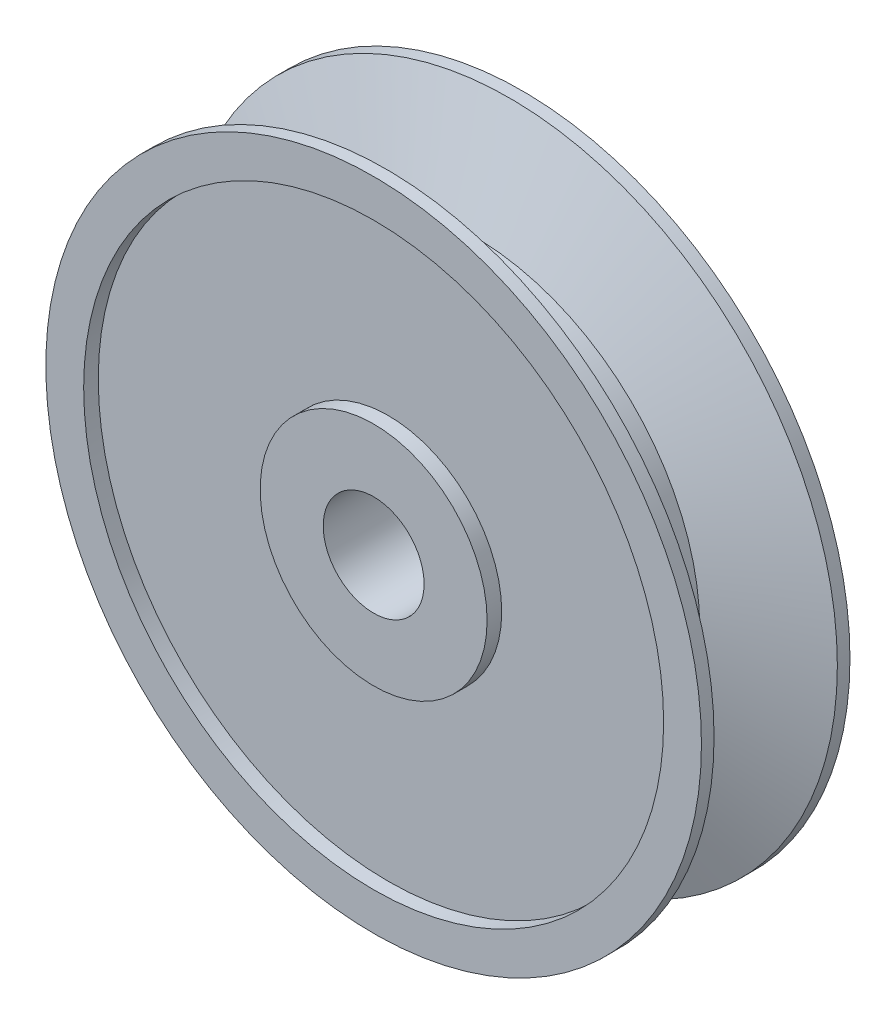
ISO-10303-21;
HEADER;
FILE_DESCRIPTION(('STEP AP214'),'2;1');
FILE_NAME('part.step','',(''),(''),'','','');
FILE_SCHEMA(('AUTOMOTIVE_DESIGN { 1 0 10303 214 1 1 1 1 }'));
ENDSEC;
DATA;
#1=APPLICATION_CONTEXT('core data for automotive mechanical design processes');
#2=APPLICATION_PROTOCOL_DEFINITION('international standard','automotive_design',2000,#1);
#3=PRODUCT_CONTEXT('',#1,'mechanical');
#4=PRODUCT('Part','Part','',(#3));
#5=PRODUCT_RELATED_PRODUCT_CATEGORY('part','',(#4));
#6=PRODUCT_DEFINITION_FORMATION('','',#4);
#7=PRODUCT_DEFINITION_CONTEXT('part definition',#1,'design');
#8=PRODUCT_DEFINITION('design','',#6,#7);
#9=PRODUCT_DEFINITION_SHAPE('','',#8);
#10=(LENGTH_UNIT() NAMED_UNIT(*) SI_UNIT(.MILLI.,.METRE.));
#11=(NAMED_UNIT(*) PLANE_ANGLE_UNIT() SI_UNIT($,.RADIAN.));
#12=(NAMED_UNIT(*) SI_UNIT($,.STERADIAN.) SOLID_ANGLE_UNIT());
#13=UNCERTAINTY_MEASURE_WITH_UNIT(LENGTH_MEASURE(1.E-05),#10,'distance_accuracy_value','');
#14=(GEOMETRIC_REPRESENTATION_CONTEXT(3) GLOBAL_UNCERTAINTY_ASSIGNED_CONTEXT((#13)) GLOBAL_UNIT_ASSIGNED_CONTEXT((#10,
#11,#12)) REPRESENTATION_CONTEXT('',''));
#15=CARTESIAN_POINT('',(0.,0.,0.));
#16=DIRECTION('',(0.,0.,1.));
#17=DIRECTION('',(1.,0.,0.));
#18=AXIS2_PLACEMENT_3D('',#15,#16,#17);
#19=CARTESIAN_POINT('',(0.,0.,0.));
#20=DIRECTION('',(0.,0.,-1.));
#21=DIRECTION('',(1.,0.,0.));
#22=AXIS2_PLACEMENT_3D('',#19,#20,#21);
#23=CYLINDRICAL_SURFACE('',#22,26.);
#24=CARTESIAN_POINT('',(0.,0.,5.89));
#25=DIRECTION('',(0.,0.,1.));
#26=DIRECTION('',(1.,0.,0.));
#27=AXIS2_PLACEMENT_3D('',#24,#25,#26);
#28=CIRCLE('',#27,26.);
#29=CARTESIAN_POINT('',(26.,0.,5.88999999999991));
#30=VERTEX_POINT('',#29);
#31=EDGE_CURVE('E102',#30,#30,#28,.T.);
#32=ORIENTED_EDGE('',*,*,#31,.F.);
#33=EDGE_LOOP('',(#32));
#34=FACE_BOUND('',#33,.T.);
#35=CARTESIAN_POINT('',(0.,0.,4.8895916965194));
#36=DIRECTION('',(0.,0.,1.));
#37=DIRECTION('',(1.,0.,0.));
#38=AXIS2_PLACEMENT_3D('',#35,#36,#37);
#39=CIRCLE('',#38,26.);
#40=CARTESIAN_POINT('',(26.,0.,4.8895916965193));
#41=VERTEX_POINT('',#40);
#42=EDGE_CURVE('E110',#41,#41,#39,.T.);
#43=ORIENTED_EDGE('',*,*,#42,.T.);
#44=EDGE_LOOP('',(#43));
#45=FACE_BOUND('',#44,.T.);
#46=ADVANCED_FACE('F42',(#34,#45),#23,.T.);
#47=CARTESIAN_POINT('',(0.,0.,0.));
#48=DIRECTION('',(0.,0.,1.));
#49=DIRECTION('',(1.,0.,0.));
#50=AXIS2_PLACEMENT_3D('',#47,#48,#49);
#51=CYLINDRICAL_SURFACE('',#50,26.);
#52=CARTESIAN_POINT('',(0.,0.,-5.89));
#53=DIRECTION('',(0.,0.,1.));
#54=DIRECTION('',(1.,0.,0.));
#55=AXIS2_PLACEMENT_3D('',#52,#53,#54);
#56=CIRCLE('',#55,26.);
#57=CARTESIAN_POINT('',(26.,0.,-5.89000000000009));
#58=VERTEX_POINT('',#57);
#59=EDGE_CURVE('E70',#58,#58,#56,.T.);
#60=ORIENTED_EDGE('',*,*,#59,.T.);
#61=EDGE_LOOP('',(#60));
#62=FACE_BOUND('',#61,.T.);
#63=CARTESIAN_POINT('',(0.,0.,-4.8895916965194));
#64=DIRECTION('',(0.,0.,1.));
#65=DIRECTION('',(1.,0.,0.));
#66=AXIS2_PLACEMENT_3D('',#63,#64,#65);
#67=CIRCLE('',#66,26.);
#68=CARTESIAN_POINT('',(26.,0.,-4.88959169651949));
#69=VERTEX_POINT('',#68);
#70=EDGE_CURVE('E78',#69,#69,#67,.T.);
#71=ORIENTED_EDGE('',*,*,#70,.F.);
#72=EDGE_LOOP('',(#71));
#73=FACE_BOUND('',#72,.T.);
#74=ADVANCED_FACE('F141',(#62,#73),#51,.T.);
#75=CARTESIAN_POINT('',(0.,0.,0.));
#76=DIRECTION('',(0.,0.,1.));
#77=DIRECTION('',(1.,0.,0.));
#78=AXIS2_PLACEMENT_3D('',#75,#76,#77);
#79=CYLINDRICAL_SURFACE('',#78,4.);
#80=CARTESIAN_POINT('',(0.,0.,-5.89));
#81=DIRECTION('',(0.,0.,1.));
#82=DIRECTION('',(1.,0.,0.));
#83=AXIS2_PLACEMENT_3D('',#80,#81,#82);
#84=CIRCLE('',#83,4.);
#85=CARTESIAN_POINT('',(3.99999999999998,0.,-5.89000000000002));
#86=VERTEX_POINT('',#85);
#87=EDGE_CURVE('E10',#86,#86,#84,.T.);
#88=ORIENTED_EDGE('',*,*,#87,.F.);
#89=EDGE_LOOP('',(#88));
#90=FACE_BOUND('',#89,.T.);
#91=CARTESIAN_POINT('',(0.,0.,5.89));
#92=DIRECTION('',(0.,0.,1.));
#93=DIRECTION('',(1.,0.,0.));
#94=AXIS2_PLACEMENT_3D('',#91,#92,#93);
#95=CIRCLE('',#94,4.);
#96=CARTESIAN_POINT('',(4.00000000000002,0.,5.88999999999999));
#97=VERTEX_POINT('',#96);
#98=EDGE_CURVE('E82',#97,#97,#95,.T.);
#99=ORIENTED_EDGE('',*,*,#98,.T.);
#100=EDGE_LOOP('',(#99));
#101=FACE_BOUND('',#100,.T.);
#102=ADVANCED_FACE('F44',(#90,#101),#79,.F.);
#103=CARTESIAN_POINT('',(0.,4.,-5.89));
#104=DIRECTION('',(0.,0.,1.));
#105=DIRECTION('',(1.,0.,0.));
#106=AXIS2_PLACEMENT_3D('',#103,#104,#105);
#107=PLANE('',#106);
#108=CARTESIAN_POINT('',(0.,0.,-5.89));
#109=DIRECTION('',(0.,0.,1.));
#110=DIRECTION('',(1.,0.,0.));
#111=AXIS2_PLACEMENT_3D('',#108,#109,#110);
#112=CIRCLE('',#111,9.);
#113=CARTESIAN_POINT('',(8.99999999999998,0.,-5.89000000000003));
#114=VERTEX_POINT('',#113);
#115=EDGE_CURVE('E50',#114,#114,#112,.T.);
#116=ORIENTED_EDGE('',*,*,#115,.F.);
#117=EDGE_LOOP('',(#116));
#118=FACE_BOUND('',#117,.T.);
#119=ORIENTED_EDGE('',*,*,#87,.T.);
#120=EDGE_LOOP('',(#119));
#121=FACE_BOUND('',#120,.T.);
#122=ADVANCED_FACE('F174',(#118,#121),#107,.F.);
#123=CARTESIAN_POINT('',(0.,0.,0.));
#124=DIRECTION('',(0.,0.,1.));
#125=DIRECTION('',(1.,0.,0.));
#126=AXIS2_PLACEMENT_3D('',#123,#124,#125);
#127=CYLINDRICAL_SURFACE('',#126,9.);
#128=CARTESIAN_POINT('',(0.,0.,-4.73091144695688));
#129=DIRECTION('',(0.,0.,1.));
#130=DIRECTION('',(1.,0.,0.));
#131=AXIS2_PLACEMENT_3D('',#128,#129,#130);
#132=CIRCLE('',#131,9.);
#133=CARTESIAN_POINT('',(8.99999999999998,0.,-4.73091144695691));
#134=VERTEX_POINT('',#133);
#135=EDGE_CURVE('E55',#134,#134,#132,.T.);
#136=ORIENTED_EDGE('',*,*,#135,.F.);
#137=EDGE_LOOP('',(#136));
#138=FACE_BOUND('',#137,.T.);
#139=ORIENTED_EDGE('',*,*,#115,.T.);
#140=EDGE_LOOP('',(#139));
#141=FACE_BOUND('',#140,.T.);
#142=ADVANCED_FACE('F179',(#138,#141),#127,.T.);
#143=CARTESIAN_POINT('',(0.,9.,-4.73091144695688));
#144=DIRECTION('',(0.,0.,1.));
#145=DIRECTION('',(1.,0.,0.));
#146=AXIS2_PLACEMENT_3D('',#143,#144,#145);
#147=PLANE('',#146);
#148=CARTESIAN_POINT('',(0.,0.,-4.73091144695688));
#149=DIRECTION('',(0.,0.,1.));
#150=DIRECTION('',(1.,0.,0.));
#151=AXIS2_PLACEMENT_3D('',#148,#149,#150);
#152=CIRCLE('',#151,23.);
#153=CARTESIAN_POINT('',(23.,0.,-4.73091144695696));
#154=VERTEX_POINT('',#153);
#155=EDGE_CURVE('E60',#154,#154,#152,.T.);
#156=ORIENTED_EDGE('',*,*,#155,.F.);
#157=EDGE_LOOP('',(#156));
#158=FACE_BOUND('',#157,.T.);
#159=ORIENTED_EDGE('',*,*,#135,.T.);
#160=EDGE_LOOP('',(#159));
#161=FACE_BOUND('',#160,.T.);
#162=ADVANCED_FACE('F184',(#158,#161),#147,.F.);
#163=CARTESIAN_POINT('',(0.,0.,0.));
#164=DIRECTION('',(0.,0.,1.));
#165=DIRECTION('',(1.,0.,0.));
#166=AXIS2_PLACEMENT_3D('',#163,#164,#165);
#167=CYLINDRICAL_SURFACE('',#166,23.);
#168=CARTESIAN_POINT('',(0.,0.,-5.89));
#169=DIRECTION('',(0.,0.,1.));
#170=DIRECTION('',(1.,0.,0.));
#171=AXIS2_PLACEMENT_3D('',#168,#169,#170);
#172=CIRCLE('',#171,23.);
#173=CARTESIAN_POINT('',(23.,0.,-5.89000000000008));
#174=VERTEX_POINT('',#173);
#175=EDGE_CURVE('E66',#174,#174,#172,.T.);
#176=ORIENTED_EDGE('',*,*,#175,.F.);
#177=EDGE_LOOP('',(#176));
#178=FACE_BOUND('',#177,.T.);
#179=ORIENTED_EDGE('',*,*,#155,.T.);
#180=EDGE_LOOP('',(#179));
#181=FACE_BOUND('',#180,.T.);
#182=ADVANCED_FACE('F136',(#178,#181),#167,.F.);
#183=CARTESIAN_POINT('',(0.,23.,-5.89));
#184=DIRECTION('',(0.,0.,1.));
#185=DIRECTION('',(1.,0.,0.));
#186=AXIS2_PLACEMENT_3D('',#183,#184,#185);
#187=PLANE('',#186);
#188=ORIENTED_EDGE('',*,*,#59,.F.);
#189=EDGE_LOOP('',(#188));
#190=FACE_BOUND('',#189,.T.);
#191=ORIENTED_EDGE('',*,*,#175,.T.);
#192=EDGE_LOOP('',(#191));
#193=FACE_BOUND('',#192,.T.);
#194=ADVANCED_FACE('F126',(#190,#193),#187,.F.);
#195=CARTESIAN_POINT('',(0.,0.,0.));
#196=DIRECTION('',(0.,0.,1.));
#197=DIRECTION('',(1.,0.,0.));
#198=AXIS2_PLACEMENT_3D('',#195,#196,#197);
#199=CYLINDRICAL_SURFACE('',#198,18.);
#200=CARTESIAN_POINT('',(0.,0.,-1.97782982238981));
#201=DIRECTION('',(0.,0.,1.));
#202=DIRECTION('',(1.,0.,0.));
#203=AXIS2_PLACEMENT_3D('',#200,#201,#202);
#204=CIRCLE('',#203,18.);
#205=CARTESIAN_POINT('',(18.,0.,-1.97782982238987));
#206=VERTEX_POINT('',#205);
#207=EDGE_CURVE('E74',#206,#206,#204,.T.);
#208=ORIENTED_EDGE('',*,*,#207,.T.);
#209=EDGE_LOOP('',(#208));
#210=FACE_BOUND('',#209,.T.);
#211=CARTESIAN_POINT('',(0.,0.,1.97782982238981));
#212=DIRECTION('',(0.,0.,1.));
#213=DIRECTION('',(1.,0.,0.));
#214=AXIS2_PLACEMENT_3D('',#211,#212,#213);
#215=CIRCLE('',#214,18.);
#216=CARTESIAN_POINT('',(18.,0.,1.97782982238974));
#217=VERTEX_POINT('',#216);
#218=EDGE_CURVE('E106',#217,#217,#215,.T.);
#219=ORIENTED_EDGE('',*,*,#218,.F.);
#220=EDGE_LOOP('',(#219));
#221=FACE_BOUND('',#220,.T.);
#222=ADVANCED_FACE('F123',(#210,#221),#199,.T.);
#223=CARTESIAN_POINT('',(0.,0.,-1.97782982238981));
#224=DIRECTION('',(0.,0.,-1.));
#225=DIRECTION('',(-1.,0.,0.));
#226=AXIS2_PLACEMENT_3D('',#223,#224,#225);
#227=CONICAL_SURFACE('',#226,18.,1.22173047639603);
#228=ORIENTED_EDGE('',*,*,#70,.T.);
#229=EDGE_LOOP('',(#228));
#230=FACE_BOUND('',#229,.T.);
#231=ORIENTED_EDGE('',*,*,#207,.F.);
#232=EDGE_LOOP('',(#231));
#233=FACE_BOUND('',#232,.T.);
#234=ADVANCED_FACE('F125',(#230,#233),#227,.T.);
#235=CARTESIAN_POINT('',(0.,4.,5.89));
#236=DIRECTION('',(0.,0.,-1.));
#237=DIRECTION('',(1.,0.,0.));
#238=AXIS2_PLACEMENT_3D('',#235,#236,#237);
#239=PLANE('',#238);
#240=CARTESIAN_POINT('',(0.,0.,5.89));
#241=DIRECTION('',(0.,0.,1.));
#242=DIRECTION('',(1.,0.,0.));
#243=AXIS2_PLACEMENT_3D('',#240,#241,#242);
#244=CIRCLE('',#243,9.);
#245=CARTESIAN_POINT('',(9.00000000000002,0.,5.88999999999997));
#246=VERTEX_POINT('',#245);
#247=EDGE_CURVE('E86',#246,#246,#244,.T.);
#248=ORIENTED_EDGE('',*,*,#247,.T.);
#249=EDGE_LOOP('',(#248));
#250=FACE_BOUND('',#249,.T.);
#251=ORIENTED_EDGE('',*,*,#98,.F.);
#252=EDGE_LOOP('',(#251));
#253=FACE_BOUND('',#252,.T.);
#254=ADVANCED_FACE('F133',(#250,#253),#239,.F.);
#255=CARTESIAN_POINT('',(0.,0.,0.));
#256=DIRECTION('',(0.,0.,-1.));
#257=DIRECTION('',(1.,0.,0.));
#258=AXIS2_PLACEMENT_3D('',#255,#256,#257);
#259=CYLINDRICAL_SURFACE('',#258,9.);
#260=CARTESIAN_POINT('',(0.,0.,4.73091144695688));
#261=DIRECTION('',(0.,0.,1.));
#262=DIRECTION('',(1.,0.,0.));
#263=AXIS2_PLACEMENT_3D('',#260,#261,#262);
#264=CIRCLE('',#263,9.);
#265=CARTESIAN_POINT('',(9.00000000000002,0.,4.73091144695685));
#266=VERTEX_POINT('',#265);
#267=EDGE_CURVE('E90',#266,#266,#264,.T.);
#268=ORIENTED_EDGE('',*,*,#267,.T.);
#269=EDGE_LOOP('',(#268));
#270=FACE_BOUND('',#269,.T.);
#271=ORIENTED_EDGE('',*,*,#247,.F.);
#272=EDGE_LOOP('',(#271));
#273=FACE_BOUND('',#272,.T.);
#274=ADVANCED_FACE('F160',(#270,#273),#259,.T.);
#275=CARTESIAN_POINT('',(0.,9.,4.73091144695688));
#276=DIRECTION('',(0.,0.,-1.));
#277=DIRECTION('',(1.,0.,0.));
#278=AXIS2_PLACEMENT_3D('',#275,#276,#277);
#279=PLANE('',#278);
#280=CARTESIAN_POINT('',(0.,0.,4.73091144695688));
#281=DIRECTION('',(0.,0.,1.));
#282=DIRECTION('',(1.,0.,0.));
#283=AXIS2_PLACEMENT_3D('',#280,#281,#282);
#284=CIRCLE('',#283,23.);
#285=CARTESIAN_POINT('',(23.,0.,4.7309114469568));
#286=VERTEX_POINT('',#285);
#287=EDGE_CURVE('E94',#286,#286,#284,.T.);
#288=ORIENTED_EDGE('',*,*,#287,.T.);
#289=EDGE_LOOP('',(#288));
#290=FACE_BOUND('',#289,.T.);
#291=ORIENTED_EDGE('',*,*,#267,.F.);
#292=EDGE_LOOP('',(#291));
#293=FACE_BOUND('',#292,.T.);
#294=ADVANCED_FACE('F156',(#290,#293),#279,.F.);
#295=CARTESIAN_POINT('',(0.,0.,0.));
#296=DIRECTION('',(0.,0.,-1.));
#297=DIRECTION('',(1.,0.,0.));
#298=AXIS2_PLACEMENT_3D('',#295,#296,#297);
#299=CYLINDRICAL_SURFACE('',#298,23.);
#300=CARTESIAN_POINT('',(0.,0.,5.89));
#301=DIRECTION('',(0.,0.,1.));
#302=DIRECTION('',(1.,0.,0.));
#303=AXIS2_PLACEMENT_3D('',#300,#301,#302);
#304=CIRCLE('',#303,23.);
#305=CARTESIAN_POINT('',(23.,0.,5.88999999999992));
#306=VERTEX_POINT('',#305);
#307=EDGE_CURVE('E98',#306,#306,#304,.T.);
#308=ORIENTED_EDGE('',*,*,#307,.T.);
#309=EDGE_LOOP('',(#308));
#310=FACE_BOUND('',#309,.T.);
#311=ORIENTED_EDGE('',*,*,#287,.F.);
#312=EDGE_LOOP('',(#311));
#313=FACE_BOUND('',#312,.T.);
#314=ADVANCED_FACE('F152',(#310,#313),#299,.F.);
#315=CARTESIAN_POINT('',(0.,23.,5.89));
#316=DIRECTION('',(0.,0.,-1.));
#317=DIRECTION('',(1.,0.,0.));
#318=AXIS2_PLACEMENT_3D('',#315,#316,#317);
#319=PLANE('',#318);
#320=ORIENTED_EDGE('',*,*,#31,.T.);
#321=EDGE_LOOP('',(#320));
#322=FACE_BOUND('',#321,.T.);
#323=ORIENTED_EDGE('',*,*,#307,.F.);
#324=EDGE_LOOP('',(#323));
#325=FACE_BOUND('',#324,.T.);
#326=ADVANCED_FACE('F119',(#322,#325),#319,.F.);
#327=CARTESIAN_POINT('',(0.,0.,1.97782982238981));
#328=DIRECTION('',(0.,0.,1.));
#329=DIRECTION('',(-1.,0.,0.));
#330=AXIS2_PLACEMENT_3D('',#327,#328,#329);
#331=CONICAL_SURFACE('',#330,18.,1.22173047639603);
#332=ORIENTED_EDGE('',*,*,#42,.F.);
#333=EDGE_LOOP('',(#332));
#334=FACE_BOUND('',#333,.T.);
#335=ORIENTED_EDGE('',*,*,#218,.T.);
#336=EDGE_LOOP('',(#335));
#337=FACE_BOUND('',#336,.T.);
#338=ADVANCED_FACE('F116',(#334,#337),#331,.T.);
#339=CLOSED_SHELL('',(#46,#74,#102,#122,#142,#162,#182,#194,#222,#234,#254,#274,#294,#314,#326,#338));
#340=MANIFOLD_SOLID_BREP('B2',#339);
#341=ADVANCED_BREP_SHAPE_REPRESENTATION('',(#18,#340),#14);
#342=SHAPE_DEFINITION_REPRESENTATION(#9,#341);
ENDSEC;
END-ISO-10303-21;
